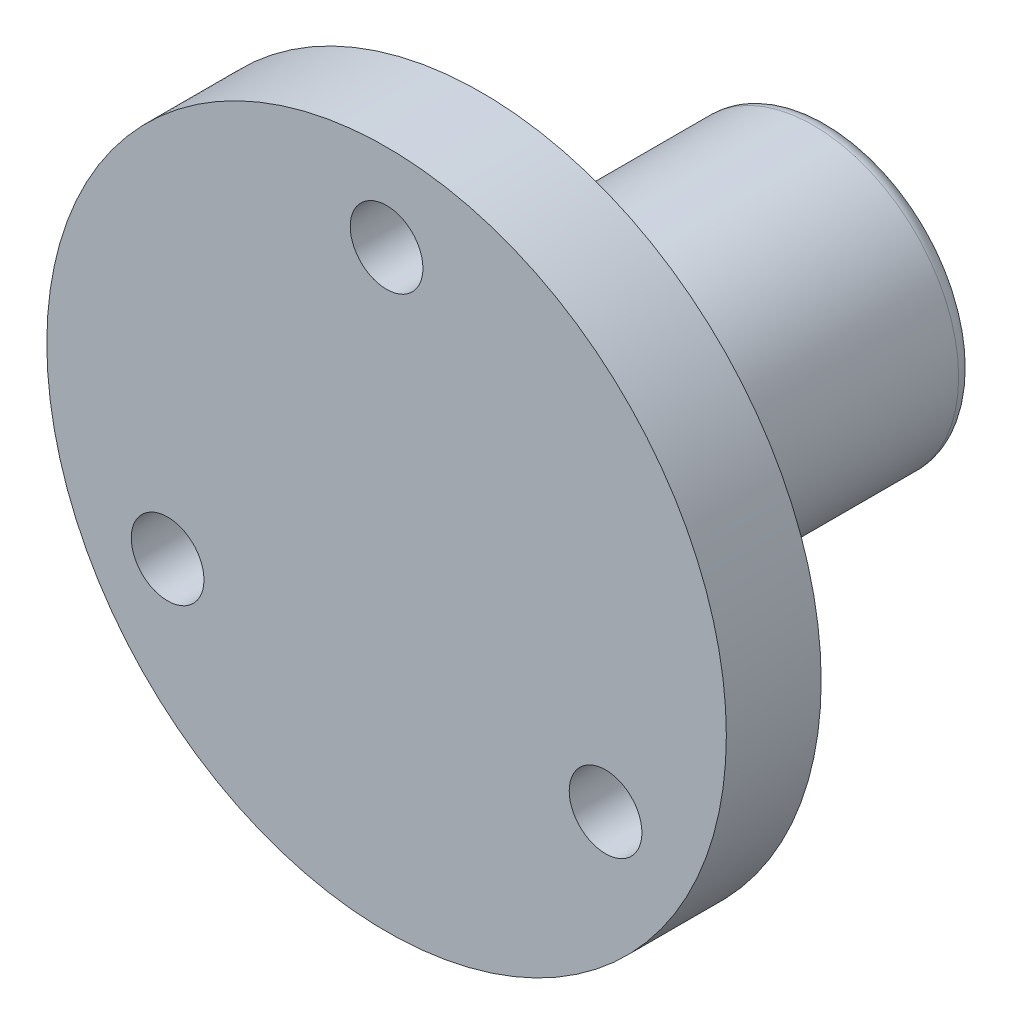
ISO-10303-21;
HEADER;
FILE_DESCRIPTION(('STEP AP214'),'2;1');
FILE_NAME('part.step','',(''),(''),'','','');
FILE_SCHEMA(('AUTOMOTIVE_DESIGN { 1 0 10303 214 1 1 1 1 }'));
ENDSEC;
DATA;
#1=APPLICATION_CONTEXT('core data for automotive mechanical design processes');
#2=APPLICATION_PROTOCOL_DEFINITION('international standard','automotive_design',2000,#1);
#3=PRODUCT_CONTEXT('',#1,'mechanical');
#4=PRODUCT('Part','Part','',(#3));
#5=PRODUCT_RELATED_PRODUCT_CATEGORY('part','',(#4));
#6=PRODUCT_DEFINITION_FORMATION('','',#4);
#7=PRODUCT_DEFINITION_CONTEXT('part definition',#1,'design');
#8=PRODUCT_DEFINITION('design','',#6,#7);
#9=PRODUCT_DEFINITION_SHAPE('','',#8);
#10=(LENGTH_UNIT() NAMED_UNIT(*) SI_UNIT(.MILLI.,.METRE.));
#11=(NAMED_UNIT(*) PLANE_ANGLE_UNIT() SI_UNIT($,.RADIAN.));
#12=(NAMED_UNIT(*) SI_UNIT($,.STERADIAN.) SOLID_ANGLE_UNIT());
#13=UNCERTAINTY_MEASURE_WITH_UNIT(LENGTH_MEASURE(1.E-05),#10,'distance_accuracy_value','');
#14=(GEOMETRIC_REPRESENTATION_CONTEXT(3) GLOBAL_UNCERTAINTY_ASSIGNED_CONTEXT((#13)) GLOBAL_UNIT_ASSIGNED_CONTEXT((#10,
#11,#12)) REPRESENTATION_CONTEXT('',''));
#15=CARTESIAN_POINT('',(0.,0.,0.));
#16=DIRECTION('',(0.,0.,1.));
#17=DIRECTION('',(1.,0.,0.));
#18=AXIS2_PLACEMENT_3D('',#15,#16,#17);
#19=CARTESIAN_POINT('',(26.8532032302755,-11.,3.));
#20=DIRECTION('',(0.,0.,-1.));
#21=DIRECTION('',(-1.,0.,0.));
#22=AXIS2_PLACEMENT_3D('',#19,#20,#21);
#23=CYLINDRICAL_SURFACE('',#22,1.15);
#24=CARTESIAN_POINT('',(26.8532032302755,-11.,3.));
#25=DIRECTION('',(0.,0.,1.));
#26=DIRECTION('',(1.,0.,0.));
#27=AXIS2_PLACEMENT_3D('',#24,#25,#26);
#28=CIRCLE('',#27,1.15);
#29=CARTESIAN_POINT('',(28.0032032302755,-11.,3.));
#30=VERTEX_POINT('',#29);
#31=EDGE_CURVE('E386',#30,#30,#28,.T.);
#32=ORIENTED_EDGE('',*,*,#31,.T.);
#33=EDGE_LOOP('',(#32));
#34=FACE_BOUND('',#33,.T.);
#35=CARTESIAN_POINT('',(26.8532032302755,-11.,1.));
#36=DIRECTION('',(0.,0.,-1.));
#37=DIRECTION('',(-1.,0.,0.));
#38=AXIS2_PLACEMENT_3D('',#35,#36,#37);
#39=CIRCLE('',#38,1.15);
#40=CARTESIAN_POINT('',(25.7032032302755,-11.,1.));
#41=VERTEX_POINT('',#40);
#42=EDGE_CURVE('E391',#41,#41,#39,.T.);
#43=ORIENTED_EDGE('',*,*,#42,.T.);
#44=EDGE_LOOP('',(#43));
#45=FACE_BOUND('',#44,.T.);
#46=ADVANCED_FACE('F45',(#34,#45),#23,.F.);
#47=CARTESIAN_POINT('',(19.925,0.99999999999999,3.));
#48=DIRECTION('',(0.,0.,-1.));
#49=DIRECTION('',(-1.,0.,0.));
#50=AXIS2_PLACEMENT_3D('',#47,#48,#49);
#51=CYLINDRICAL_SURFACE('',#50,1.15);
#52=CARTESIAN_POINT('',(19.925,0.99999999999999,3.));
#53=DIRECTION('',(0.,0.,1.));
#54=DIRECTION('',(1.,0.,0.));
#55=AXIS2_PLACEMENT_3D('',#52,#53,#54);
#56=CIRCLE('',#55,1.15);
#57=CARTESIAN_POINT('',(21.075,0.99999999999999,3.));
#58=VERTEX_POINT('',#57);
#59=EDGE_CURVE('E390',#58,#58,#56,.T.);
#60=ORIENTED_EDGE('',*,*,#59,.T.);
#61=EDGE_LOOP('',(#60));
#62=FACE_BOUND('',#61,.T.);
#63=CARTESIAN_POINT('',(19.925,0.99999999999999,1.));
#64=DIRECTION('',(0.,0.,-1.));
#65=DIRECTION('',(-1.,0.,0.));
#66=AXIS2_PLACEMENT_3D('',#63,#64,#65);
#67=CIRCLE('',#66,1.15);
#68=CARTESIAN_POINT('',(18.775,0.99999999999999,1.));
#69=VERTEX_POINT('',#68);
#70=EDGE_CURVE('E435',#69,#69,#67,.T.);
#71=ORIENTED_EDGE('',*,*,#70,.T.);
#72=EDGE_LOOP('',(#71));
#73=FACE_BOUND('',#72,.T.);
#74=ADVANCED_FACE('F464',(#62,#73),#51,.F.);
#75=CARTESIAN_POINT('',(12.9967967697245,-11.,3.));
#76=DIRECTION('',(0.,0.,-1.));
#77=DIRECTION('',(-1.,0.,0.));
#78=AXIS2_PLACEMENT_3D('',#75,#76,#77);
#79=CYLINDRICAL_SURFACE('',#78,1.15);
#80=CARTESIAN_POINT('',(12.9967967697245,-11.,3.));
#81=DIRECTION('',(0.,0.,1.));
#82=DIRECTION('',(1.,0.,0.));
#83=AXIS2_PLACEMENT_3D('',#80,#81,#82);
#84=CIRCLE('',#83,1.15);
#85=CARTESIAN_POINT('',(14.1467967697245,-11.,3.));
#86=VERTEX_POINT('',#85);
#87=EDGE_CURVE('E395',#86,#86,#84,.T.);
#88=ORIENTED_EDGE('',*,*,#87,.T.);
#89=EDGE_LOOP('',(#88));
#90=FACE_BOUND('',#89,.T.);
#91=CARTESIAN_POINT('',(12.9967967697245,-11.,1.));
#92=DIRECTION('',(0.,0.,-1.));
#93=DIRECTION('',(-1.,0.,0.));
#94=AXIS2_PLACEMENT_3D('',#91,#92,#93);
#95=CIRCLE('',#94,1.15);
#96=CARTESIAN_POINT('',(11.8467967697245,-11.,1.));
#97=VERTEX_POINT('',#96);
#98=EDGE_CURVE('E244',#97,#97,#95,.T.);
#99=ORIENTED_EDGE('',*,*,#98,.T.);
#100=EDGE_LOOP('',(#99));
#101=FACE_BOUND('',#100,.T.);
#102=ADVANCED_FACE('F470',(#90,#101),#79,.F.);
#103=CARTESIAN_POINT('',(19.925,-7.00000000000001,-11.));
#104=DIRECTION('',(0.,0.,1.));
#105=DIRECTION('',(1.,0.,0.));
#106=AXIS2_PLACEMENT_3D('',#103,#104,#105);
#107=CYLINDRICAL_SURFACE('',#106,4.6);
#108=CARTESIAN_POINT('',(19.925,-7.00000000000001,-10.5));
#109=DIRECTION('',(0.,0.,1.));
#110=DIRECTION('',(1.,0.,0.));
#111=AXIS2_PLACEMENT_3D('',#108,#109,#110);
#112=CIRCLE('',#111,4.6);
#113=CARTESIAN_POINT('',(24.525,-7.00000000000001,-10.5));
#114=VERTEX_POINT('',#113);
#115=EDGE_CURVE('E54',#114,#114,#112,.T.);
#116=ORIENTED_EDGE('',*,*,#115,.T.);
#117=EDGE_LOOP('',(#116));
#118=FACE_BOUND('',#117,.T.);
#119=CARTESIAN_POINT('',(19.925,-7.00000000000001,-1.));
#120=DIRECTION('',(0.,0.,1.));
#121=DIRECTION('',(1.,0.,0.));
#122=AXIS2_PLACEMENT_3D('',#119,#120,#121);
#123=CIRCLE('',#122,4.6);
#124=CARTESIAN_POINT('',(24.525,-7.00000000000001,-1.));
#125=VERTEX_POINT('',#124);
#126=EDGE_CURVE('E445',#125,#125,#123,.F.);
#127=ORIENTED_EDGE('',*,*,#126,.T.);
#128=EDGE_LOOP('',(#127));
#129=FACE_BOUND('',#128,.T.);
#130=ADVANCED_FACE('F452',(#118,#129),#107,.T.);
#131=CARTESIAN_POINT('',(19.925,-7.00000000000001,-11.));
#132=DIRECTION('',(0.,0.,1.));
#133=DIRECTION('',(1.,0.,0.));
#134=AXIS2_PLACEMENT_3D('',#131,#132,#133);
#135=PLANE('',#134);
#136=CARTESIAN_POINT('',(19.925,-7.00000000000001,-11.));
#137=DIRECTION('',(0.,0.,1.));
#138=DIRECTION('',(1.,0.,0.));
#139=AXIS2_PLACEMENT_3D('',#136,#137,#138);
#140=CIRCLE('',#139,4.1);
#141=CARTESIAN_POINT('',(24.025,-7.00000000000001,-11.));
#142=VERTEX_POINT('',#141);
#143=EDGE_CURVE('E11',#142,#142,#140,.F.);
#144=ORIENTED_EDGE('',*,*,#143,.T.);
#145=EDGE_LOOP('',(#144));
#146=FACE_BOUND('',#145,.T.);
#147=DIRECTION('',(-1.,0.,0.));
#148=VECTOR('',#147,1.);
#149=CARTESIAN_POINT('',(18.0877197773544,-4.5031216722725,-11.));
#150=LINE('',#149,#148);
#151=CARTESIAN_POINT('',(21.7622802226456,-4.50312167227249,-11.));
#152=VERTEX_POINT('',#151);
#153=CARTESIAN_POINT('',(18.0877197773544,-4.5031216722725,-11.));
#154=VERTEX_POINT('',#153);
#155=EDGE_CURVE('E412',#152,#154,#150,.T.);
#156=ORIENTED_EDGE('',*,*,#155,.T.);
#157=CARTESIAN_POINT('',(19.925,-7.00000000000001,-11.));
#158=DIRECTION('',(0.,0.,1.));
#159=DIRECTION('',(1.,0.,0.));
#160=AXIS2_PLACEMENT_3D('',#157,#158,#159);
#161=CIRCLE('',#160,3.10000000000001);
#162=EDGE_CURVE('E408',#154,#152,#161,.T.);
#163=ORIENTED_EDGE('',*,*,#162,.T.);
#164=EDGE_LOOP('',(#156,#163));
#165=FACE_BOUND('',#164,.T.);
#166=ADVANCED_FACE('F501',(#146,#165),#135,.F.);
#167=CARTESIAN_POINT('',(19.925,-7.00000000000001,-11.));
#168=DIRECTION('',(0.,0.,1.));
#169=DIRECTION('',(1.,0.,0.));
#170=AXIS2_PLACEMENT_3D('',#167,#168,#169);
#171=CYLINDRICAL_SURFACE('',#170,3.10000000000001);
#172=CARTESIAN_POINT('',(19.925,-7.00000000000001,0.));
#173=DIRECTION('',(0.,0.,1.));
#174=DIRECTION('',(1.,0.,0.));
#175=AXIS2_PLACEMENT_3D('',#172,#173,#174);
#176=CIRCLE('',#175,3.10000000000001);
#177=CARTESIAN_POINT('',(18.0877197773544,-4.5031216722725,0.));
#178=VERTEX_POINT('',#177);
#179=CARTESIAN_POINT('',(21.7622802226456,-4.50312167227249,0.));
#180=VERTEX_POINT('',#179);
#181=EDGE_CURVE('E404',#178,#180,#176,.T.);
#182=ORIENTED_EDGE('',*,*,#181,.T.);
#183=DIRECTION('',(0.,0.,1.));
#184=VECTOR('',#183,1.);
#185=CARTESIAN_POINT('',(21.7622802226456,-4.50312167227249,-11.));
#186=LINE('',#185,#184);
#187=EDGE_CURVE('E417',#152,#180,#186,.T.);
#188=ORIENTED_EDGE('',*,*,#187,.F.);
#189=ORIENTED_EDGE('',*,*,#162,.F.);
#190=DIRECTION('',(0.,0.,1.));
#191=VECTOR('',#190,1.);
#192=CARTESIAN_POINT('',(18.0877197773544,-4.5031216722725,-11.));
#193=LINE('',#192,#191);
#194=EDGE_CURVE('E424',#154,#178,#193,.T.);
#195=ORIENTED_EDGE('',*,*,#194,.T.);
#196=EDGE_LOOP('',(#182,#188,#189,#195));
#197=FACE_BOUND('',#196,.T.);
#198=ADVANCED_FACE('F497',(#197),#171,.F.);
#199=CARTESIAN_POINT('',(18.0877197773544,-4.5031216722725,-11.));
#200=DIRECTION('',(0.,1.,0.));
#201=DIRECTION('',(-1.,0.,0.));
#202=AXIS2_PLACEMENT_3D('',#199,#200,#201);
#203=PLANE('',#202);
#204=DIRECTION('',(-1.,0.,0.));
#205=VECTOR('',#204,1.);
#206=CARTESIAN_POINT('',(18.0877197773544,-4.5031216722725,0.));
#207=LINE('',#206,#205);
#208=EDGE_CURVE('E413',#180,#178,#207,.T.);
#209=ORIENTED_EDGE('',*,*,#208,.T.);
#210=ORIENTED_EDGE('',*,*,#194,.F.);
#211=ORIENTED_EDGE('',*,*,#155,.F.);
#212=ORIENTED_EDGE('',*,*,#187,.T.);
#213=EDGE_LOOP('',(#209,#210,#211,#212));
#214=FACE_BOUND('',#213,.T.);
#215=ADVANCED_FACE('F493',(#214),#203,.F.);
#216=CARTESIAN_POINT('',(19.925,-7.00000000000001,3.));
#217=DIRECTION('',(0.,0.,-1.));
#218=DIRECTION('',(-1.,0.,0.));
#219=AXIS2_PLACEMENT_3D('',#216,#217,#218);
#220=CYLINDRICAL_SURFACE('',#219,10.75);
#221=CARTESIAN_POINT('',(19.925,-7.00000000000001,3.));
#222=DIRECTION('',(0.,0.,1.));
#223=DIRECTION('',(1.,0.,0.));
#224=AXIS2_PLACEMENT_3D('',#221,#222,#223);
#225=CIRCLE('',#224,10.75);
#226=CARTESIAN_POINT('',(30.675,-7.00000000000001,3.));
#227=VERTEX_POINT('',#226);
#228=EDGE_CURVE('E400',#227,#227,#225,.T.);
#229=ORIENTED_EDGE('',*,*,#228,.F.);
#230=EDGE_LOOP('',(#229));
#231=FACE_BOUND('',#230,.T.);
#232=CARTESIAN_POINT('',(19.925,-7.00000000000001,0.));
#233=DIRECTION('',(0.,0.,1.));
#234=DIRECTION('',(1.,0.,0.));
#235=AXIS2_PLACEMENT_3D('',#232,#233,#234);
#236=CIRCLE('',#235,10.75);
#237=CARTESIAN_POINT('',(30.675,-7.00000000000001,0.));
#238=VERTEX_POINT('',#237);
#239=EDGE_CURVE('E399',#238,#238,#236,.T.);
#240=ORIENTED_EDGE('',*,*,#239,.T.);
#241=EDGE_LOOP('',(#240));
#242=FACE_BOUND('',#241,.T.);
#243=ADVANCED_FACE('F489',(#231,#242),#220,.T.);
#244=CARTESIAN_POINT('',(19.925,-7.00000000000001,0.));
#245=DIRECTION('',(0.,0.,1.));
#246=DIRECTION('',(1.,0.,0.));
#247=AXIS2_PLACEMENT_3D('',#244,#245,#246);
#248=PLANE('',#247);
#249=CARTESIAN_POINT('',(19.925,-7.00000000000001,0.));
#250=DIRECTION('',(0.,0.,1.));
#251=DIRECTION('',(1.,0.,0.));
#252=AXIS2_PLACEMENT_3D('',#249,#250,#251);
#253=CIRCLE('',#252,5.60000000000001);
#254=CARTESIAN_POINT('',(25.525,-7.00000000000001,0.));
#255=VERTEX_POINT('',#254);
#256=EDGE_CURVE('E428',#255,#255,#253,.T.);
#257=ORIENTED_EDGE('',*,*,#256,.T.);
#258=EDGE_LOOP('',(#257));
#259=FACE_BOUND('',#258,.T.);
#260=DIRECTION('',(1.,0.,0.));
#261=VECTOR('',#260,1.);
#262=CARTESIAN_POINT('',(25.5541651245988,-8.75000000000006,0.));
#263=LINE('',#262,#261);
#264=CARTESIAN_POINT('',(25.5541651245988,-8.75000000000006,0.));
#265=VERTEX_POINT('',#264);
#266=CARTESIAN_POINT('',(28.1522413359521,-8.75000000000004,0.));
#267=VERTEX_POINT('',#266);
#268=EDGE_CURVE('E227',#265,#267,#263,.T.);
#269=ORIENTED_EDGE('',*,*,#268,.F.);
#270=DIRECTION('',(0.499999999999996,0.866025403784441,0.));
#271=VECTOR('',#270,1.);
#272=CARTESIAN_POINT('',(24.2551270189222,-11.0000000000001,0.));
#273=LINE('',#272,#271);
#274=CARTESIAN_POINT('',(24.2551270189222,-11.0000000000001,0.));
#275=VERTEX_POINT('',#274);
#276=EDGE_CURVE('E61',#275,#265,#273,.T.);
#277=ORIENTED_EDGE('',*,*,#276,.F.);
#278=DIRECTION('',(-0.500000000000005,0.866025403784436,0.));
#279=VECTOR('',#278,1.);
#280=CARTESIAN_POINT('',(25.5541651245988,-13.2500000000001,0.));
#281=LINE('',#280,#279);
#282=CARTESIAN_POINT('',(25.5541651245988,-13.2500000000001,0.));
#283=VERTEX_POINT('',#282);
#284=EDGE_CURVE('E207',#283,#275,#281,.T.);
#285=ORIENTED_EDGE('',*,*,#284,.F.);
#286=DIRECTION('',(-1.,0.,0.));
#287=VECTOR('',#286,1.);
#288=CARTESIAN_POINT('',(28.1522413359522,-13.25,0.));
#289=LINE('',#288,#287);
#290=CARTESIAN_POINT('',(28.1522413359522,-13.25,0.));
#291=VERTEX_POINT('',#290);
#292=EDGE_CURVE('E211',#291,#283,#289,.T.);
#293=ORIENTED_EDGE('',*,*,#292,.F.);
#294=DIRECTION('',(-0.499999999999995,-0.866025403784442,0.));
#295=VECTOR('',#294,1.);
#296=CARTESIAN_POINT('',(29.4512794416288,-11.,0.));
#297=LINE('',#296,#295);
#298=CARTESIAN_POINT('',(29.4512794416288,-11.,0.));
#299=VERTEX_POINT('',#298);
#300=EDGE_CURVE('E234',#299,#291,#297,.T.);
#301=ORIENTED_EDGE('',*,*,#300,.F.);
#302=DIRECTION('',(0.500000000000005,-0.866025403784436,0.));
#303=VECTOR('',#302,1.);
#304=CARTESIAN_POINT('',(28.1522413359521,-8.75000000000004,0.));
#305=LINE('',#304,#303);
#306=EDGE_CURVE('E230',#267,#299,#305,.T.);
#307=ORIENTED_EDGE('',*,*,#306,.F.);
#308=EDGE_LOOP('',(#269,#277,#285,#293,#301,#307));
#309=FACE_BOUND('',#308,.T.);
#310=DIRECTION('',(-0.500000000000001,-0.866025403784438,0.));
#311=VECTOR('',#310,1.);
#312=CARTESIAN_POINT('',(22.5230762113533,0.999999999999991,0.));
#313=LINE('',#312,#311);
#314=CARTESIAN_POINT('',(22.5230762113533,0.99999999999999,0.));
#315=VERTEX_POINT('',#314);
#316=CARTESIAN_POINT('',(21.2240381056767,-1.25000000000001,0.));
#317=VERTEX_POINT('',#316);
#318=EDGE_CURVE('E293',#315,#317,#313,.T.);
#319=ORIENTED_EDGE('',*,*,#318,.F.);
#320=DIRECTION('',(0.499999999999999,-0.866025403784439,0.));
#321=VECTOR('',#320,1.);
#322=CARTESIAN_POINT('',(21.2240381056767,3.24999999999999,0.));
#323=LINE('',#322,#321);
#324=CARTESIAN_POINT('',(21.2240381056767,3.24999999999999,0.));
#325=VERTEX_POINT('',#324);
#326=EDGE_CURVE('E69',#325,#315,#323,.T.);
#327=ORIENTED_EDGE('',*,*,#326,.F.);
#328=DIRECTION('',(1.,0.,0.));
#329=VECTOR('',#328,1.);
#330=CARTESIAN_POINT('',(18.6259618943233,3.24999999999999,0.));
#331=LINE('',#330,#329);
#332=CARTESIAN_POINT('',(18.6259618943233,3.24999999999999,0.));
#333=VERTEX_POINT('',#332);
#334=EDGE_CURVE('E276',#333,#325,#331,.T.);
#335=ORIENTED_EDGE('',*,*,#334,.F.);
#336=DIRECTION('',(0.5,0.866025403784439,0.));
#337=VECTOR('',#336,1.);
#338=CARTESIAN_POINT('',(17.3269237886467,0.999999999999989,0.));
#339=LINE('',#338,#337);
#340=CARTESIAN_POINT('',(17.3269237886467,0.999999999999989,0.));
#341=VERTEX_POINT('',#340);
#342=EDGE_CURVE('E280',#341,#333,#339,.T.);
#343=ORIENTED_EDGE('',*,*,#342,.F.);
#344=DIRECTION('',(-0.499999999999999,0.866025403784439,0.));
#345=VECTOR('',#344,1.);
#346=CARTESIAN_POINT('',(18.6259618943233,-1.25000000000001,0.));
#347=LINE('',#346,#345);
#348=CARTESIAN_POINT('',(18.6259618943233,-1.25000000000001,0.));
#349=VERTEX_POINT('',#348);
#350=EDGE_CURVE('E285',#349,#341,#347,.T.);
#351=ORIENTED_EDGE('',*,*,#350,.F.);
#352=DIRECTION('',(-1.,0.,0.));
#353=VECTOR('',#352,1.);
#354=CARTESIAN_POINT('',(21.2240381056767,-1.25000000000001,0.));
#355=LINE('',#354,#353);
#356=EDGE_CURVE('E289',#317,#349,#355,.T.);
#357=ORIENTED_EDGE('',*,*,#356,.F.);
#358=EDGE_LOOP('',(#319,#327,#335,#343,#351,#357));
#359=FACE_BOUND('',#358,.T.);
#360=DIRECTION('',(0.500000000000002,-0.866025403784438,0.));
#361=VECTOR('',#360,1.);
#362=CARTESIAN_POINT('',(14.2958348754012,-8.75000000000004,0.));
#363=LINE('',#362,#361);
#364=CARTESIAN_POINT('',(14.2958348754012,-8.75000000000004,0.));
#365=VERTEX_POINT('',#364);
#366=CARTESIAN_POINT('',(15.5948729810778,-11.,0.));
#367=VERTEX_POINT('',#366);
#368=EDGE_CURVE('E358',#365,#367,#363,.T.);
#369=ORIENTED_EDGE('',*,*,#368,.F.);
#370=DIRECTION('',(1.,0.,0.));
#371=VECTOR('',#370,1.);
#372=CARTESIAN_POINT('',(11.6977586640478,-8.75000000000005,0.));
#373=LINE('',#372,#371);
#374=CARTESIAN_POINT('',(11.6977586640478,-8.75000000000005,0.));
#375=VERTEX_POINT('',#374);
#376=EDGE_CURVE('E275',#375,#365,#373,.T.);
#377=ORIENTED_EDGE('',*,*,#376,.F.);
#378=DIRECTION('',(0.499999999999999,0.866025403784439,0.));
#379=VECTOR('',#378,1.);
#380=CARTESIAN_POINT('',(10.3987205583712,-11.0000000000001,0.));
#381=LINE('',#380,#379);
#382=CARTESIAN_POINT('',(10.3987205583712,-11.0000000000001,0.));
#383=VERTEX_POINT('',#382);
#384=EDGE_CURVE('E341',#383,#375,#381,.T.);
#385=ORIENTED_EDGE('',*,*,#384,.F.);
#386=DIRECTION('',(-0.500000000000001,0.866025403784438,0.));
#387=VECTOR('',#386,1.);
#388=CARTESIAN_POINT('',(11.6977586640478,-13.2500000000001,0.));
#389=LINE('',#388,#387);
#390=CARTESIAN_POINT('',(11.6977586640478,-13.2500000000001,0.));
#391=VERTEX_POINT('',#390);
#392=EDGE_CURVE('E345',#391,#383,#389,.T.);
#393=ORIENTED_EDGE('',*,*,#392,.F.);
#394=DIRECTION('',(-1.,0.,0.));
#395=VECTOR('',#394,1.);
#396=CARTESIAN_POINT('',(14.2958348754012,-13.25,0.));
#397=LINE('',#396,#395);
#398=CARTESIAN_POINT('',(14.2958348754012,-13.25,0.));
#399=VERTEX_POINT('',#398);
#400=EDGE_CURVE('E350',#399,#391,#397,.T.);
#401=ORIENTED_EDGE('',*,*,#400,.F.);
#402=DIRECTION('',(-0.499999999999999,-0.866025403784439,0.));
#403=VECTOR('',#402,1.);
#404=CARTESIAN_POINT('',(15.5948729810778,-11.,0.));
#405=LINE('',#404,#403);
#406=EDGE_CURVE('E354',#367,#399,#405,.T.);
#407=ORIENTED_EDGE('',*,*,#406,.F.);
#408=EDGE_LOOP('',(#369,#377,#385,#393,#401,#407));
#409=FACE_BOUND('',#408,.T.);
#410=ORIENTED_EDGE('',*,*,#239,.F.);
#411=EDGE_LOOP('',(#410));
#412=FACE_BOUND('',#411,.T.);
#413=ADVANCED_FACE('F485',(#259,#309,#359,#409,#412),#248,.F.);
#414=CARTESIAN_POINT('',(19.925,-7.00000000000001,3.));
#415=DIRECTION('',(0.,0.,1.));
#416=DIRECTION('',(1.,0.,0.));
#417=AXIS2_PLACEMENT_3D('',#414,#415,#416);
#418=PLANE('',#417);
#419=ORIENTED_EDGE('',*,*,#59,.F.);
#420=EDGE_LOOP('',(#419));
#421=FACE_BOUND('',#420,.T.);
#422=ORIENTED_EDGE('',*,*,#228,.T.);
#423=EDGE_LOOP('',(#422));
#424=FACE_BOUND('',#423,.T.);
#425=ORIENTED_EDGE('',*,*,#87,.F.);
#426=EDGE_LOOP('',(#425));
#427=FACE_BOUND('',#426,.T.);
#428=ORIENTED_EDGE('',*,*,#31,.F.);
#429=EDGE_LOOP('',(#428));
#430=FACE_BOUND('',#429,.T.);
#431=ADVANCED_FACE('F481',(#421,#424,#427,#430),#418,.T.);
#432=ORIENTED_EDGE('',*,*,#181,.F.);
#433=ORIENTED_EDGE('',*,*,#208,.F.);
#434=EDGE_LOOP('',(#432,#433));
#435=FACE_BOUND('',#434,.T.);
#436=ADVANCED_FACE('F484',(#435),#248,.F.);
#437=CARTESIAN_POINT('',(11.6977586640478,-8.75000000000005,1.));
#438=DIRECTION('',(0.,1.,0.));
#439=DIRECTION('',(-1.,0.,0.));
#440=AXIS2_PLACEMENT_3D('',#437,#438,#439);
#441=PLANE('',#440);
#442=ORIENTED_EDGE('',*,*,#376,.T.);
#443=DIRECTION('',(0.,0.,-1.));
#444=VECTOR('',#443,1.);
#445=CARTESIAN_POINT('',(14.2958348754012,-8.75000000000004,1.));
#446=LINE('',#445,#444);
#447=CARTESIAN_POINT('',(14.2958348754012,-8.75000000000004,1.));
#448=VERTEX_POINT('',#447);
#449=EDGE_CURVE('E321',#448,#365,#446,.T.);
#450=ORIENTED_EDGE('',*,*,#449,.F.);
#451=DIRECTION('',(1.,0.,0.));
#452=VECTOR('',#451,1.);
#453=CARTESIAN_POINT('',(11.6977586640478,-8.75000000000005,1.));
#454=LINE('',#453,#452);
#455=CARTESIAN_POINT('',(11.6977586640478,-8.75000000000005,1.));
#456=VERTEX_POINT('',#455);
#457=EDGE_CURVE('E346',#456,#448,#454,.T.);
#458=ORIENTED_EDGE('',*,*,#457,.F.);
#459=DIRECTION('',(0.,0.,-1.));
#460=VECTOR('',#459,1.);
#461=CARTESIAN_POINT('',(11.6977586640478,-8.75000000000005,1.));
#462=LINE('',#461,#460);
#463=EDGE_CURVE('E338',#456,#375,#462,.T.);
#464=ORIENTED_EDGE('',*,*,#463,.T.);
#465=EDGE_LOOP('',(#442,#450,#458,#464));
#466=FACE_BOUND('',#465,.T.);
#467=ADVANCED_FACE('F546',(#466),#441,.F.);
#468=CARTESIAN_POINT('',(10.3987205583712,-11.0000000000001,1.));
#469=DIRECTION('',(-0.86602540378444,0.499999999999999,0.));
#470=DIRECTION('',(-0.499999999999999,-0.866025403784439,0.));
#471=AXIS2_PLACEMENT_3D('',#468,#469,#470);
#472=PLANE('',#471);
#473=ORIENTED_EDGE('',*,*,#384,.T.);
#474=ORIENTED_EDGE('',*,*,#463,.F.);
#475=DIRECTION('',(0.499999999999999,0.866025403784439,0.));
#476=VECTOR('',#475,1.);
#477=CARTESIAN_POINT('',(10.3987205583712,-11.0000000000001,1.));
#478=LINE('',#477,#476);
#479=CARTESIAN_POINT('',(10.3987205583712,-11.0000000000001,1.));
#480=VERTEX_POINT('',#479);
#481=EDGE_CURVE('E325',#480,#456,#478,.T.);
#482=ORIENTED_EDGE('',*,*,#481,.F.);
#483=DIRECTION('',(0.,0.,-1.));
#484=VECTOR('',#483,1.);
#485=CARTESIAN_POINT('',(10.3987205583712,-11.0000000000001,1.));
#486=LINE('',#485,#484);
#487=EDGE_CURVE('E335',#480,#383,#486,.T.);
#488=ORIENTED_EDGE('',*,*,#487,.T.);
#489=EDGE_LOOP('',(#473,#474,#482,#488));
#490=FACE_BOUND('',#489,.T.);
#491=ADVANCED_FACE('F553',(#490),#472,.F.);
#492=CARTESIAN_POINT('',(11.6977586640478,-13.2500000000001,1.));
#493=DIRECTION('',(-0.866025403784438,-0.500000000000001,0.));
#494=DIRECTION('',(0.500000000000001,-0.866025403784438,0.));
#495=AXIS2_PLACEMENT_3D('',#492,#493,#494);
#496=PLANE('',#495);
#497=ORIENTED_EDGE('',*,*,#392,.T.);
#498=ORIENTED_EDGE('',*,*,#487,.F.);
#499=DIRECTION('',(-0.500000000000001,0.866025403784438,0.));
#500=VECTOR('',#499,1.);
#501=CARTESIAN_POINT('',(11.6977586640478,-13.2500000000001,1.));
#502=LINE('',#501,#500);
#503=CARTESIAN_POINT('',(11.6977586640478,-13.2500000000001,1.));
#504=VERTEX_POINT('',#503);
#505=EDGE_CURVE('E367',#504,#480,#502,.T.);
#506=ORIENTED_EDGE('',*,*,#505,.F.);
#507=DIRECTION('',(0.,0.,-1.));
#508=VECTOR('',#507,1.);
#509=CARTESIAN_POINT('',(11.6977586640478,-13.2500000000001,1.));
#510=LINE('',#509,#508);
#511=EDGE_CURVE('E332',#504,#391,#510,.T.);
#512=ORIENTED_EDGE('',*,*,#511,.T.);
#513=EDGE_LOOP('',(#497,#498,#506,#512));
#514=FACE_BOUND('',#513,.T.);
#515=ADVANCED_FACE('F561',(#514),#496,.F.);
#516=CARTESIAN_POINT('',(14.2958348754012,-13.25,1.));
#517=DIRECTION('',(0.,-1.,0.));
#518=DIRECTION('',(1.,0.,0.));
#519=AXIS2_PLACEMENT_3D('',#516,#517,#518);
#520=PLANE('',#519);
#521=ORIENTED_EDGE('',*,*,#400,.T.);
#522=ORIENTED_EDGE('',*,*,#511,.F.);
#523=DIRECTION('',(-1.,0.,0.));
#524=VECTOR('',#523,1.);
#525=CARTESIAN_POINT('',(14.2958348754012,-13.25,1.));
#526=LINE('',#525,#524);
#527=CARTESIAN_POINT('',(14.2958348754012,-13.25,1.));
#528=VERTEX_POINT('',#527);
#529=EDGE_CURVE('E371',#528,#504,#526,.T.);
#530=ORIENTED_EDGE('',*,*,#529,.F.);
#531=DIRECTION('',(0.,0.,-1.));
#532=VECTOR('',#531,1.);
#533=CARTESIAN_POINT('',(14.2958348754012,-13.25,1.));
#534=LINE('',#533,#532);
#535=EDGE_CURVE('E329',#528,#399,#534,.T.);
#536=ORIENTED_EDGE('',*,*,#535,.T.);
#537=EDGE_LOOP('',(#521,#522,#530,#536));
#538=FACE_BOUND('',#537,.T.);
#539=ADVANCED_FACE('F568',(#538),#520,.F.);
#540=CARTESIAN_POINT('',(15.5948729810778,-11.,1.));
#541=DIRECTION('',(0.86602540378444,-0.499999999999999,0.));
#542=DIRECTION('',(0.499999999999999,0.866025403784439,0.));
#543=AXIS2_PLACEMENT_3D('',#540,#541,#542);
#544=PLANE('',#543);
#545=ORIENTED_EDGE('',*,*,#406,.T.);
#546=ORIENTED_EDGE('',*,*,#535,.F.);
#547=DIRECTION('',(-0.499999999999999,-0.866025403784439,0.));
#548=VECTOR('',#547,1.);
#549=CARTESIAN_POINT('',(15.5948729810778,-11.,1.));
#550=LINE('',#549,#548);
#551=CARTESIAN_POINT('',(15.5948729810778,-11.,1.));
#552=VERTEX_POINT('',#551);
#553=EDGE_CURVE('E375',#552,#528,#550,.T.);
#554=ORIENTED_EDGE('',*,*,#553,.F.);
#555=DIRECTION('',(0.,0.,-1.));
#556=VECTOR('',#555,1.);
#557=CARTESIAN_POINT('',(15.5948729810778,-11.,1.));
#558=LINE('',#557,#556);
#559=EDGE_CURVE('E326',#552,#367,#558,.T.);
#560=ORIENTED_EDGE('',*,*,#559,.T.);
#561=EDGE_LOOP('',(#545,#546,#554,#560));
#562=FACE_BOUND('',#561,.T.);
#563=ADVANCED_FACE('F576',(#562),#544,.F.);
#564=CARTESIAN_POINT('',(14.2958348754012,-8.75000000000004,1.));
#565=DIRECTION('',(0.866025403784438,0.500000000000002,0.));
#566=DIRECTION('',(-0.500000000000002,0.866025403784438,0.));
#567=AXIS2_PLACEMENT_3D('',#564,#565,#566);
#568=PLANE('',#567);
#569=ORIENTED_EDGE('',*,*,#368,.T.);
#570=ORIENTED_EDGE('',*,*,#559,.F.);
#571=DIRECTION('',(0.500000000000002,-0.866025403784438,0.));
#572=VECTOR('',#571,1.);
#573=CARTESIAN_POINT('',(14.2958348754012,-8.75000000000004,1.));
#574=LINE('',#573,#572);
#575=EDGE_CURVE('E379',#448,#552,#574,.T.);
#576=ORIENTED_EDGE('',*,*,#575,.F.);
#577=ORIENTED_EDGE('',*,*,#449,.T.);
#578=EDGE_LOOP('',(#569,#570,#576,#577));
#579=FACE_BOUND('',#578,.T.);
#580=ADVANCED_FACE('F584',(#579),#568,.F.);
#581=CARTESIAN_POINT('',(0.,0.,1.));
#582=DIRECTION('',(0.,0.,-1.));
#583=DIRECTION('',(-1.,0.,0.));
#584=AXIS2_PLACEMENT_3D('',#581,#582,#583);
#585=PLANE('',#584);
#586=ORIENTED_EDGE('',*,*,#98,.F.);
#587=EDGE_LOOP('',(#586));
#588=FACE_BOUND('',#587,.T.);
#589=ORIENTED_EDGE('',*,*,#457,.T.);
#590=ORIENTED_EDGE('',*,*,#575,.T.);
#591=ORIENTED_EDGE('',*,*,#553,.T.);
#592=ORIENTED_EDGE('',*,*,#529,.T.);
#593=ORIENTED_EDGE('',*,*,#505,.T.);
#594=ORIENTED_EDGE('',*,*,#481,.T.);
#595=EDGE_LOOP('',(#589,#590,#591,#592,#593,#594));
#596=FACE_BOUND('',#595,.T.);
#597=ADVANCED_FACE('F475',(#588,#596),#585,.T.);
#598=CARTESIAN_POINT('',(21.2240381056767,3.24999999999999,1.));
#599=DIRECTION('',(0.866025403784439,0.499999999999999,0.));
#600=DIRECTION('',(-0.499999999999999,0.866025403784439,0.));
#601=AXIS2_PLACEMENT_3D('',#598,#599,#600);
#602=PLANE('',#601);
#603=ORIENTED_EDGE('',*,*,#326,.T.);
#604=DIRECTION('',(0.,0.,-1.));
#605=VECTOR('',#604,1.);
#606=CARTESIAN_POINT('',(22.5230762113533,0.999999999999991,1.));
#607=LINE('',#606,#605);
#608=CARTESIAN_POINT('',(22.5230762113533,0.999999999999991,1.));
#609=VERTEX_POINT('',#608);
#610=EDGE_CURVE('E256',#609,#315,#607,.T.);
#611=ORIENTED_EDGE('',*,*,#610,.F.);
#612=DIRECTION('',(0.499999999999999,-0.866025403784439,0.));
#613=VECTOR('',#612,1.);
#614=CARTESIAN_POINT('',(21.2240381056767,3.24999999999999,1.));
#615=LINE('',#614,#613);
#616=CARTESIAN_POINT('',(21.2240381056767,3.24999999999999,1.));
#617=VERTEX_POINT('',#616);
#618=EDGE_CURVE('E281',#617,#609,#615,.T.);
#619=ORIENTED_EDGE('',*,*,#618,.F.);
#620=DIRECTION('',(0.,0.,-1.));
#621=VECTOR('',#620,1.);
#622=CARTESIAN_POINT('',(21.2240381056767,3.24999999999999,1.));
#623=LINE('',#622,#621);
#624=EDGE_CURVE('E272',#617,#325,#623,.T.);
#625=ORIENTED_EDGE('',*,*,#624,.T.);
#626=EDGE_LOOP('',(#603,#611,#619,#625));
#627=FACE_BOUND('',#626,.T.);
#628=ADVANCED_FACE('F599',(#627),#602,.F.);
#629=CARTESIAN_POINT('',(18.6259618943233,3.24999999999999,1.));
#630=DIRECTION('',(0.,1.,0.));
#631=DIRECTION('',(-1.,0.,0.));
#632=AXIS2_PLACEMENT_3D('',#629,#630,#631);
#633=PLANE('',#632);
#634=ORIENTED_EDGE('',*,*,#334,.T.);
#635=ORIENTED_EDGE('',*,*,#624,.F.);
#636=DIRECTION('',(1.,0.,0.));
#637=VECTOR('',#636,1.);
#638=CARTESIAN_POINT('',(18.6259618943233,3.24999999999999,1.));
#639=LINE('',#638,#637);
#640=CARTESIAN_POINT('',(18.6259618943233,3.24999999999999,1.));
#641=VERTEX_POINT('',#640);
#642=EDGE_CURVE('E259',#641,#617,#639,.T.);
#643=ORIENTED_EDGE('',*,*,#642,.F.);
#644=DIRECTION('',(0.,0.,-1.));
#645=VECTOR('',#644,1.);
#646=CARTESIAN_POINT('',(18.6259618943233,3.24999999999999,1.));
#647=LINE('',#646,#645);
#648=EDGE_CURVE('E269',#641,#333,#647,.T.);
#649=ORIENTED_EDGE('',*,*,#648,.T.);
#650=EDGE_LOOP('',(#634,#635,#643,#649));
#651=FACE_BOUND('',#650,.T.);
#652=ADVANCED_FACE('F606',(#651),#633,.F.);
#653=CARTESIAN_POINT('',(17.3269237886467,0.999999999999989,1.));
#654=DIRECTION('',(-0.866025403784439,0.5,0.));
#655=DIRECTION('',(-0.5,-0.866025403784439,0.));
#656=AXIS2_PLACEMENT_3D('',#653,#654,#655);
#657=PLANE('',#656);
#658=ORIENTED_EDGE('',*,*,#342,.T.);
#659=ORIENTED_EDGE('',*,*,#648,.F.);
#660=DIRECTION('',(0.5,0.866025403784439,0.));
#661=VECTOR('',#660,1.);
#662=CARTESIAN_POINT('',(17.3269237886467,0.999999999999989,1.));
#663=LINE('',#662,#661);
#664=CARTESIAN_POINT('',(17.3269237886467,0.999999999999989,1.));
#665=VERTEX_POINT('',#664);
#666=EDGE_CURVE('E302',#665,#641,#663,.T.);
#667=ORIENTED_EDGE('',*,*,#666,.F.);
#668=DIRECTION('',(0.,0.,-1.));
#669=VECTOR('',#668,1.);
#670=CARTESIAN_POINT('',(17.3269237886467,0.999999999999989,1.));
#671=LINE('',#670,#669);
#672=EDGE_CURVE('E266',#665,#341,#671,.T.);
#673=ORIENTED_EDGE('',*,*,#672,.T.);
#674=EDGE_LOOP('',(#658,#659,#667,#673));
#675=FACE_BOUND('',#674,.T.);
#676=ADVANCED_FACE('F613',(#675),#657,.F.);
#677=CARTESIAN_POINT('',(18.6259618943233,-1.25000000000001,1.));
#678=DIRECTION('',(-0.866025403784439,-0.499999999999999,0.));
#679=DIRECTION('',(0.499999999999999,-0.866025403784439,0.));
#680=AXIS2_PLACEMENT_3D('',#677,#678,#679);
#681=PLANE('',#680);
#682=ORIENTED_EDGE('',*,*,#350,.T.);
#683=ORIENTED_EDGE('',*,*,#672,.F.);
#684=DIRECTION('',(-0.499999999999999,0.866025403784439,0.));
#685=VECTOR('',#684,1.);
#686=CARTESIAN_POINT('',(18.6259618943233,-1.25000000000001,1.));
#687=LINE('',#686,#685);
#688=CARTESIAN_POINT('',(18.6259618943233,-1.25000000000001,1.));
#689=VERTEX_POINT('',#688);
#690=EDGE_CURVE('E306',#689,#665,#687,.T.);
#691=ORIENTED_EDGE('',*,*,#690,.F.);
#692=DIRECTION('',(0.,0.,-1.));
#693=VECTOR('',#692,1.);
#694=CARTESIAN_POINT('',(18.6259618943233,-1.25000000000001,1.));
#695=LINE('',#694,#693);
#696=EDGE_CURVE('E263',#689,#349,#695,.T.);
#697=ORIENTED_EDGE('',*,*,#696,.T.);
#698=EDGE_LOOP('',(#682,#683,#691,#697));
#699=FACE_BOUND('',#698,.T.);
#700=ADVANCED_FACE('F621',(#699),#681,.F.);
#701=CARTESIAN_POINT('',(21.2240381056767,-1.25000000000001,1.));
#702=DIRECTION('',(0.,-1.,0.));
#703=DIRECTION('',(0.,0.,-1.));
#704=AXIS2_PLACEMENT_3D('',#701,#702,#703);
#705=PLANE('',#704);
#706=ORIENTED_EDGE('',*,*,#356,.T.);
#707=ORIENTED_EDGE('',*,*,#696,.F.);
#708=DIRECTION('',(-1.,0.,0.));
#709=VECTOR('',#708,1.);
#710=CARTESIAN_POINT('',(21.2240381056767,-1.25000000000001,1.));
#711=LINE('',#710,#709);
#712=CARTESIAN_POINT('',(21.2240381056767,-1.25000000000001,1.));
#713=VERTEX_POINT('',#712);
#714=EDGE_CURVE('E310',#713,#689,#711,.T.);
#715=ORIENTED_EDGE('',*,*,#714,.F.);
#716=DIRECTION('',(0.,0.,-1.));
#717=VECTOR('',#716,1.);
#718=CARTESIAN_POINT('',(21.2240381056767,-1.25000000000001,1.));
#719=LINE('',#718,#717);
#720=EDGE_CURVE('E260',#713,#317,#719,.T.);
#721=ORIENTED_EDGE('',*,*,#720,.T.);
#722=EDGE_LOOP('',(#706,#707,#715,#721));
#723=FACE_BOUND('',#722,.T.);
#724=ADVANCED_FACE('F629',(#723),#705,.F.);
#725=CARTESIAN_POINT('',(22.5230762113533,0.999999999999991,1.));
#726=DIRECTION('',(0.866025403784438,-0.500000000000001,0.));
#727=DIRECTION('',(0.500000000000001,0.866025403784438,0.));
#728=AXIS2_PLACEMENT_3D('',#725,#726,#727);
#729=PLANE('',#728);
#730=ORIENTED_EDGE('',*,*,#318,.T.);
#731=ORIENTED_EDGE('',*,*,#720,.F.);
#732=DIRECTION('',(-0.500000000000001,-0.866025403784438,0.));
#733=VECTOR('',#732,1.);
#734=CARTESIAN_POINT('',(22.5230762113533,0.999999999999991,1.));
#735=LINE('',#734,#733);
#736=EDGE_CURVE('E314',#609,#713,#735,.T.);
#737=ORIENTED_EDGE('',*,*,#736,.F.);
#738=ORIENTED_EDGE('',*,*,#610,.T.);
#739=EDGE_LOOP('',(#730,#731,#737,#738));
#740=FACE_BOUND('',#739,.T.);
#741=ADVANCED_FACE('F637',(#740),#729,.F.);
#742=CARTESIAN_POINT('',(0.,0.,1.));
#743=DIRECTION('',(0.,0.,-1.));
#744=DIRECTION('',(-1.,0.,0.));
#745=AXIS2_PLACEMENT_3D('',#742,#743,#744);
#746=PLANE('',#745);
#747=ORIENTED_EDGE('',*,*,#70,.F.);
#748=EDGE_LOOP('',(#747));
#749=FACE_BOUND('',#748,.T.);
#750=ORIENTED_EDGE('',*,*,#618,.T.);
#751=ORIENTED_EDGE('',*,*,#736,.T.);
#752=ORIENTED_EDGE('',*,*,#714,.T.);
#753=ORIENTED_EDGE('',*,*,#690,.T.);
#754=ORIENTED_EDGE('',*,*,#666,.T.);
#755=ORIENTED_EDGE('',*,*,#642,.T.);
#756=EDGE_LOOP('',(#750,#751,#752,#753,#754,#755));
#757=FACE_BOUND('',#756,.T.);
#758=ADVANCED_FACE('F645',(#749,#757),#746,.T.);
#759=CARTESIAN_POINT('',(24.2551270189222,-11.0000000000001,1.));
#760=DIRECTION('',(-0.866025403784441,0.499999999999996,0.));
#761=DIRECTION('',(-0.499999999999996,-0.866025403784441,0.));
#762=AXIS2_PLACEMENT_3D('',#759,#760,#761);
#763=PLANE('',#762);
#764=ORIENTED_EDGE('',*,*,#276,.T.);
#765=DIRECTION('',(0.,0.,-1.));
#766=VECTOR('',#765,1.);
#767=CARTESIAN_POINT('',(25.5541651245988,-8.75000000000006,1.));
#768=LINE('',#767,#766);
#769=CARTESIAN_POINT('',(25.5541651245988,-8.75000000000006,1.));
#770=VERTEX_POINT('',#769);
#771=EDGE_CURVE('E181',#770,#265,#768,.T.);
#772=ORIENTED_EDGE('',*,*,#771,.F.);
#773=DIRECTION('',(0.499999999999996,0.866025403784441,0.));
#774=VECTOR('',#773,1.);
#775=CARTESIAN_POINT('',(24.2551270189222,-11.0000000000001,1.));
#776=LINE('',#775,#774);
#777=CARTESIAN_POINT('',(24.2551270189222,-11.0000000000001,1.));
#778=VERTEX_POINT('',#777);
#779=EDGE_CURVE('E185',#778,#770,#776,.T.);
#780=ORIENTED_EDGE('',*,*,#779,.F.);
#781=DIRECTION('',(0.,0.,-1.));
#782=VECTOR('',#781,1.);
#783=CARTESIAN_POINT('',(24.2551270189222,-11.0000000000001,1.));
#784=LINE('',#783,#782);
#785=EDGE_CURVE('E241',#778,#275,#784,.T.);
#786=ORIENTED_EDGE('',*,*,#785,.T.);
#787=EDGE_LOOP('',(#764,#772,#780,#786));
#788=FACE_BOUND('',#787,.T.);
#789=ADVANCED_FACE('F183',(#788),#763,.F.);
#790=CARTESIAN_POINT('',(25.5541651245988,-13.2500000000001,1.));
#791=DIRECTION('',(-0.866025403784436,-0.500000000000005,0.));
#792=DIRECTION('',(0.500000000000005,-0.866025403784436,0.));
#793=AXIS2_PLACEMENT_3D('',#790,#791,#792);
#794=PLANE('',#793);
#795=ORIENTED_EDGE('',*,*,#284,.T.);
#796=ORIENTED_EDGE('',*,*,#785,.F.);
#797=DIRECTION('',(-0.500000000000005,0.866025403784436,0.));
#798=VECTOR('',#797,1.);
#799=CARTESIAN_POINT('',(25.5541651245988,-13.2500000000001,1.));
#800=LINE('',#799,#798);
#801=CARTESIAN_POINT('',(25.5541651245988,-13.2500000000001,1.));
#802=VERTEX_POINT('',#801);
#803=EDGE_CURVE('E192',#802,#778,#800,.T.);
#804=ORIENTED_EDGE('',*,*,#803,.F.);
#805=DIRECTION('',(0.,0.,-1.));
#806=VECTOR('',#805,1.);
#807=CARTESIAN_POINT('',(25.5541651245988,-13.2500000000001,1.));
#808=LINE('',#807,#806);
#809=EDGE_CURVE('E245',#802,#283,#808,.T.);
#810=ORIENTED_EDGE('',*,*,#809,.T.);
#811=EDGE_LOOP('',(#795,#796,#804,#810));
#812=FACE_BOUND('',#811,.T.);
#813=ADVANCED_FACE('F660',(#812),#794,.F.);
#814=CARTESIAN_POINT('',(28.1522413359522,-13.25,1.));
#815=DIRECTION('',(0.,-1.,0.));
#816=DIRECTION('',(1.,0.,0.));
#817=AXIS2_PLACEMENT_3D('',#814,#815,#816);
#818=PLANE('',#817);
#819=ORIENTED_EDGE('',*,*,#292,.T.);
#820=ORIENTED_EDGE('',*,*,#809,.F.);
#821=DIRECTION('',(-1.,0.,0.));
#822=VECTOR('',#821,1.);
#823=CARTESIAN_POINT('',(28.1522413359522,-13.25,1.));
#824=LINE('',#823,#822);
#825=CARTESIAN_POINT('',(28.1522413359522,-13.25,1.));
#826=VERTEX_POINT('',#825);
#827=EDGE_CURVE('E220',#826,#802,#824,.T.);
#828=ORIENTED_EDGE('',*,*,#827,.F.);
#829=DIRECTION('',(0.,0.,-1.));
#830=VECTOR('',#829,1.);
#831=CARTESIAN_POINT('',(28.1522413359522,-13.25,1.));
#832=LINE('',#831,#830);
#833=EDGE_CURVE('E248',#826,#291,#832,.T.);
#834=ORIENTED_EDGE('',*,*,#833,.T.);
#835=EDGE_LOOP('',(#819,#820,#828,#834));
#836=FACE_BOUND('',#835,.T.);
#837=ADVANCED_FACE('F667',(#836),#818,.F.);
#838=CARTESIAN_POINT('',(29.4512794416288,-11.,1.));
#839=DIRECTION('',(0.866025403784442,-0.499999999999995,0.));
#840=DIRECTION('',(0.499999999999995,0.866025403784442,0.));
#841=AXIS2_PLACEMENT_3D('',#838,#839,#840);
#842=PLANE('',#841);
#843=ORIENTED_EDGE('',*,*,#300,.T.);
#844=ORIENTED_EDGE('',*,*,#833,.F.);
#845=DIRECTION('',(-0.499999999999995,-0.866025403784442,0.));
#846=VECTOR('',#845,1.);
#847=CARTESIAN_POINT('',(29.4512794416288,-11.,1.));
#848=LINE('',#847,#846);
#849=CARTESIAN_POINT('',(29.4512794416288,-11.,1.));
#850=VERTEX_POINT('',#849);
#851=EDGE_CURVE('E216',#850,#826,#848,.T.);
#852=ORIENTED_EDGE('',*,*,#851,.F.);
#853=DIRECTION('',(0.,0.,-1.));
#854=VECTOR('',#853,1.);
#855=CARTESIAN_POINT('',(29.4512794416288,-11.,1.));
#856=LINE('',#855,#854);
#857=EDGE_CURVE('E251',#850,#299,#856,.T.);
#858=ORIENTED_EDGE('',*,*,#857,.T.);
#859=EDGE_LOOP('',(#843,#844,#852,#858));
#860=FACE_BOUND('',#859,.T.);
#861=ADVANCED_FACE('F675',(#860),#842,.F.);
#862=CARTESIAN_POINT('',(28.1522413359521,-8.75000000000004,1.));
#863=DIRECTION('',(0.866025403784436,0.500000000000005,0.));
#864=DIRECTION('',(-0.500000000000005,0.866025403784436,0.));
#865=AXIS2_PLACEMENT_3D('',#862,#863,#864);
#866=PLANE('',#865);
#867=ORIENTED_EDGE('',*,*,#306,.T.);
#868=ORIENTED_EDGE('',*,*,#857,.F.);
#869=DIRECTION('',(0.500000000000005,-0.866025403784436,0.));
#870=VECTOR('',#869,1.);
#871=CARTESIAN_POINT('',(28.1522413359521,-8.75000000000004,1.));
#872=LINE('',#871,#870);
#873=CARTESIAN_POINT('',(28.1522413359521,-8.75000000000004,1.));
#874=VERTEX_POINT('',#873);
#875=EDGE_CURVE('E201',#874,#850,#872,.T.);
#876=ORIENTED_EDGE('',*,*,#875,.F.);
#877=DIRECTION('',(0.,0.,-1.));
#878=VECTOR('',#877,1.);
#879=CARTESIAN_POINT('',(28.1522413359521,-8.75000000000004,1.));
#880=LINE('',#879,#878);
#881=EDGE_CURVE('E191',#874,#267,#880,.T.);
#882=ORIENTED_EDGE('',*,*,#881,.T.);
#883=EDGE_LOOP('',(#867,#868,#876,#882));
#884=FACE_BOUND('',#883,.T.);
#885=ADVANCED_FACE('F683',(#884),#866,.F.);
#886=CARTESIAN_POINT('',(25.5541651245988,-8.75000000000006,1.));
#887=DIRECTION('',(0.,1.,0.));
#888=DIRECTION('',(-1.,0.,0.));
#889=AXIS2_PLACEMENT_3D('',#886,#887,#888);
#890=PLANE('',#889);
#891=ORIENTED_EDGE('',*,*,#268,.T.);
#892=ORIENTED_EDGE('',*,*,#881,.F.);
#893=DIRECTION('',(1.,0.,0.));
#894=VECTOR('',#893,1.);
#895=CARTESIAN_POINT('',(25.5541651245988,-8.75000000000006,1.));
#896=LINE('',#895,#894);
#897=EDGE_CURVE('E195',#770,#874,#896,.T.);
#898=ORIENTED_EDGE('',*,*,#897,.F.);
#899=ORIENTED_EDGE('',*,*,#771,.T.);
#900=EDGE_LOOP('',(#891,#892,#898,#899));
#901=FACE_BOUND('',#900,.T.);
#902=ADVANCED_FACE('F196',(#901),#890,.F.);
#903=CARTESIAN_POINT('',(0.,0.,1.));
#904=DIRECTION('',(0.,0.,-1.));
#905=DIRECTION('',(-1.,0.,0.));
#906=AXIS2_PLACEMENT_3D('',#903,#904,#905);
#907=PLANE('',#906);
#908=ORIENTED_EDGE('',*,*,#42,.F.);
#909=EDGE_LOOP('',(#908));
#910=FACE_BOUND('',#909,.T.);
#911=ORIENTED_EDGE('',*,*,#779,.T.);
#912=ORIENTED_EDGE('',*,*,#897,.T.);
#913=ORIENTED_EDGE('',*,*,#875,.T.);
#914=ORIENTED_EDGE('',*,*,#851,.T.);
#915=ORIENTED_EDGE('',*,*,#827,.T.);
#916=ORIENTED_EDGE('',*,*,#803,.T.);
#917=EDGE_LOOP('',(#911,#912,#913,#914,#915,#916));
#918=FACE_BOUND('',#917,.T.);
#919=ADVANCED_FACE('F203',(#910,#918),#907,.T.);
#920=CARTESIAN_POINT('',(19.925,-7.00000000000001,0.));
#921=DIRECTION('',(0.,0.,1.));
#922=DIRECTION('',(1.,0.,0.));
#923=AXIS2_PLACEMENT_3D('',#920,#921,#922);
#924=CONICAL_SURFACE('',#923,5.60000000000001,0.785398163397452);
#925=ORIENTED_EDGE('',*,*,#126,.F.);
#926=EDGE_LOOP('',(#925));
#927=FACE_BOUND('',#926,.T.);
#928=ORIENTED_EDGE('',*,*,#256,.F.);
#929=EDGE_LOOP('',(#928));
#930=FACE_BOUND('',#929,.T.);
#931=ADVANCED_FACE('F456',(#927,#930),#924,.T.);
#932=CARTESIAN_POINT('',(19.925,-7.00000000000001,-10.5));
#933=DIRECTION('',(0.,0.,1.));
#934=DIRECTION('',(1.,0.,0.));
#935=AXIS2_PLACEMENT_3D('',#932,#933,#934);
#936=TOROIDAL_SURFACE('',#935,4.1,0.5);
#937=ORIENTED_EDGE('',*,*,#143,.F.);
#938=EDGE_LOOP('',(#937));
#939=FACE_BOUND('',#938,.T.);
#940=ORIENTED_EDGE('',*,*,#115,.F.);
#941=EDGE_LOOP('',(#940));
#942=FACE_BOUND('',#941,.T.);
#943=ADVANCED_FACE('F47',(#939,#942),#936,.T.);
#944=CLOSED_SHELL('',(#46,#74,#102,#130,#166,#198,#215,#243,#413,#431,#436,#467,#491,#515,#539,
#563,#580,#597,#628,#652,#676,#700,#724,#741,#758,#789,#813,#837,#861,#885,#902,#919,#931,#943));
#945=MANIFOLD_SOLID_BREP('B2',#944);
#946=ADVANCED_BREP_SHAPE_REPRESENTATION('',(#18,#945),#14);
#947=SHAPE_DEFINITION_REPRESENTATION(#9,#946);
ENDSEC;
END-ISO-10303-21;
